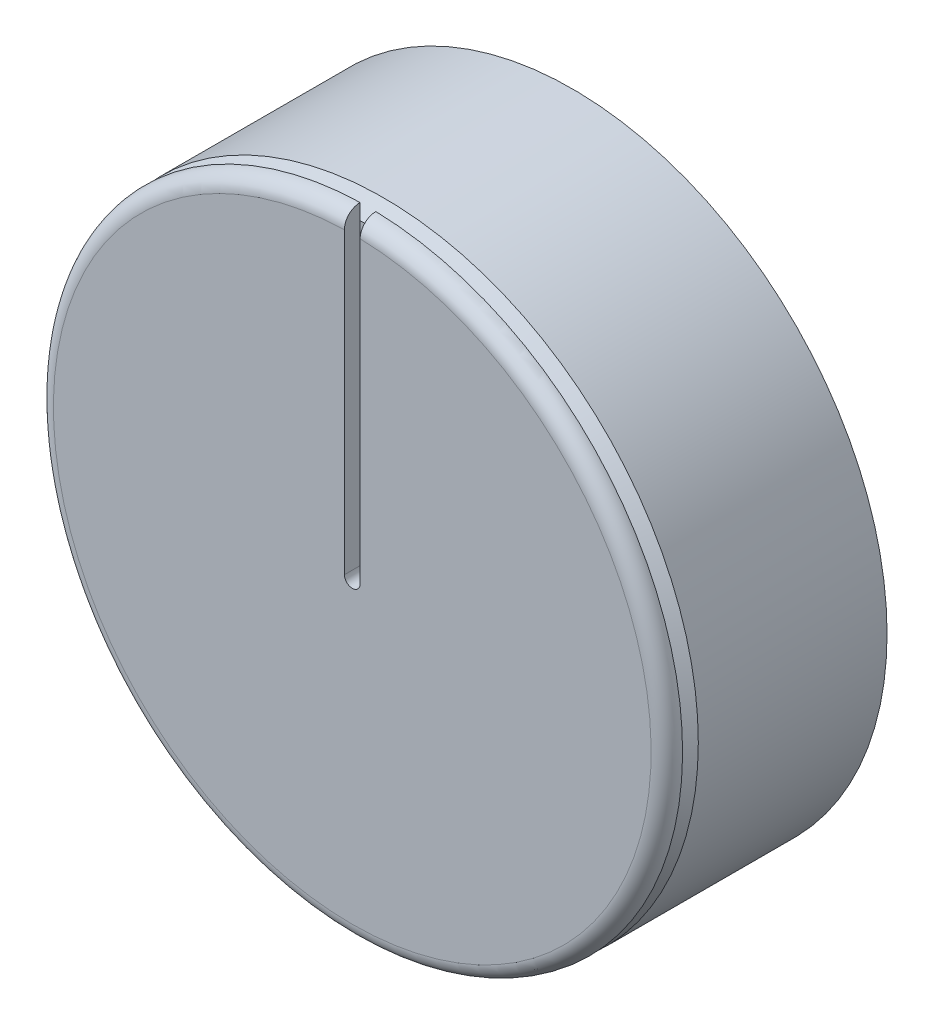
ISO-10303-21;
HEADER;
FILE_DESCRIPTION(('STEP AP214'),'2;1');
FILE_NAME('part.step','',(''),(''),'','','');
FILE_SCHEMA(('AUTOMOTIVE_DESIGN { 1 0 10303 214 1 1 1 1 }'));
ENDSEC;
DATA;
#1=APPLICATION_CONTEXT('core data for automotive mechanical design processes');
#2=APPLICATION_PROTOCOL_DEFINITION('international standard','automotive_design',2000,#1);
#3=PRODUCT_CONTEXT('',#1,'mechanical');
#4=PRODUCT('Part','Part','',(#3));
#5=PRODUCT_RELATED_PRODUCT_CATEGORY('part','',(#4));
#6=PRODUCT_DEFINITION_FORMATION('','',#4);
#7=PRODUCT_DEFINITION_CONTEXT('part definition',#1,'design');
#8=PRODUCT_DEFINITION('design','',#6,#7);
#9=PRODUCT_DEFINITION_SHAPE('','',#8);
#10=(LENGTH_UNIT() NAMED_UNIT(*) SI_UNIT(.MILLI.,.METRE.));
#11=(NAMED_UNIT(*) PLANE_ANGLE_UNIT() SI_UNIT($,.RADIAN.));
#12=(NAMED_UNIT(*) SI_UNIT($,.STERADIAN.) SOLID_ANGLE_UNIT());
#13=UNCERTAINTY_MEASURE_WITH_UNIT(LENGTH_MEASURE(1.E-05),#10,'distance_accuracy_value','');
#14=(GEOMETRIC_REPRESENTATION_CONTEXT(3) GLOBAL_UNCERTAINTY_ASSIGNED_CONTEXT((#13)) GLOBAL_UNIT_ASSIGNED_CONTEXT((#10,
#11,#12)) REPRESENTATION_CONTEXT('',''));
#15=CARTESIAN_POINT('',(0.,0.,0.));
#16=DIRECTION('',(0.,0.,1.));
#17=DIRECTION('',(1.,0.,0.));
#18=AXIS2_PLACEMENT_3D('',#15,#16,#17);
#19=CARTESIAN_POINT('',(51.1819708147866,-61.9743537667184,15.));
#20=DIRECTION('',(0.,0.,-1.));
#21=DIRECTION('',(-1.,0.,0.));
#22=AXIS2_PLACEMENT_3D('',#19,#20,#21);
#23=CYLINDRICAL_SURFACE('',#22,20.);
#24=CARTESIAN_POINT('',(51.1819708147866,-61.9743537667184,1.));
#25=DIRECTION('',(0.,0.,1.));
#26=DIRECTION('',(1.,0.,0.));
#27=AXIS2_PLACEMENT_3D('',#24,#25,#26);
#28=CIRCLE('',#27,20.);
#29=CARTESIAN_POINT('',(71.1819708147866,-61.9743537667184,1.));
#30=VERTEX_POINT('',#29);
#31=EDGE_CURVE('E132',#30,#30,#28,.T.);
#32=ORIENTED_EDGE('',*,*,#31,.T.);
#33=EDGE_LOOP('',(#32));
#34=FACE_BOUND('',#33,.T.);
#35=CARTESIAN_POINT('',(51.1819708147866,-61.9743537667184,13.));
#36=DIRECTION('',(0.,0.,1.));
#37=DIRECTION('',(1.,0.,0.));
#38=AXIS2_PLACEMENT_3D('',#35,#36,#37);
#39=CIRCLE('',#38,20.);
#40=CARTESIAN_POINT('',(71.1819708147866,-61.9743537667184,13.));
#41=VERTEX_POINT('',#40);
#42=EDGE_CURVE('E113',#41,#41,#39,.T.);
#43=ORIENTED_EDGE('',*,*,#42,.F.);
#44=EDGE_LOOP('',(#43));
#45=FACE_BOUND('',#44,.T.);
#46=ADVANCED_FACE('F43',(#34,#45),#23,.T.);
#47=CARTESIAN_POINT('',(51.1819708147866,-61.9743537667184,1.));
#48=DIRECTION('',(0.,0.,1.));
#49=DIRECTION('',(1.,0.,0.));
#50=AXIS2_PLACEMENT_3D('',#47,#48,#49);
#51=PLANE('',#50);
#52=CARTESIAN_POINT('',(51.1819708147866,-61.9743537667185,1.));
#53=DIRECTION('',(0.,0.,-1.));
#54=DIRECTION('',(-1.,0.,0.));
#55=AXIS2_PLACEMENT_3D('',#52,#53,#54);
#56=CIRCLE('',#55,10.);
#57=CARTESIAN_POINT('',(41.1819708147866,-61.9743537667185,1.));
#58=VERTEX_POINT('',#57);
#59=EDGE_CURVE('E268',#58,#58,#56,.T.);
#60=ORIENTED_EDGE('',*,*,#59,.F.);
#61=EDGE_LOOP('',(#60));
#62=FACE_BOUND('',#61,.T.);
#63=ORIENTED_EDGE('',*,*,#31,.F.);
#64=EDGE_LOOP('',(#63));
#65=FACE_BOUND('',#64,.T.);
#66=ADVANCED_FACE('F166',(#62,#65),#51,.F.);
#67=CARTESIAN_POINT('',(51.1819708147866,-61.9743537667184,14.));
#68=DIRECTION('',(0.,0.,1.));
#69=DIRECTION('',(1.,0.,0.));
#70=AXIS2_PLACEMENT_3D('',#67,#68,#69);
#71=PLANE('',#70);
#72=CARTESIAN_POINT('',(51.1819708147866,-61.9743537667184,14.));
#73=DIRECTION('',(0.,0.,1.));
#74=DIRECTION('',(1.,0.,0.));
#75=AXIS2_PLACEMENT_3D('',#72,#73,#74);
#76=CIRCLE('',#75,19.);
#77=CARTESIAN_POINT('',(50.6819708147866,-42.9809338534959,14.));
#78=VERTEX_POINT('',#77);
#79=CARTESIAN_POINT('',(51.6819708147866,-42.9809338534959,14.));
#80=VERTEX_POINT('',#79);
#81=EDGE_CURVE('E59',#78,#80,#76,.T.);
#82=ORIENTED_EDGE('',*,*,#81,.T.);
#83=DIRECTION('',(0.,1.,0.));
#84=VECTOR('',#83,1.);
#85=CARTESIAN_POINT('',(51.6819708147866,-61.9743537667184,14.));
#86=LINE('',#85,#84);
#87=CARTESIAN_POINT('',(51.6819708147866,-41.9806047435863,14.));
#88=VERTEX_POINT('',#87);
#89=EDGE_CURVE('E91',#80,#88,#86,.T.);
#90=ORIENTED_EDGE('',*,*,#89,.T.);
#91=CARTESIAN_POINT('',(51.1819708147866,-61.9743537667184,14.));
#92=DIRECTION('',(0.,0.,1.));
#93=DIRECTION('',(1.,0.,0.));
#94=AXIS2_PLACEMENT_3D('',#91,#92,#93);
#95=CIRCLE('',#94,20.);
#96=CARTESIAN_POINT('',(50.6819708147866,-41.9806047435863,14.));
#97=VERTEX_POINT('',#96);
#98=EDGE_CURVE('E139',#88,#97,#95,.F.);
#99=ORIENTED_EDGE('',*,*,#98,.T.);
#100=DIRECTION('',(0.,-1.,0.));
#101=VECTOR('',#100,1.);
#102=CARTESIAN_POINT('',(50.6819708147866,-61.9743537667184,14.));
#103=LINE('',#102,#101);
#104=EDGE_CURVE('E93',#97,#78,#103,.T.);
#105=ORIENTED_EDGE('',*,*,#104,.T.);
#106=EDGE_LOOP('',(#82,#90,#99,#105));
#107=FACE_BOUND('',#106,.T.);
#108=ADVANCED_FACE('F90',(#107),#71,.F.);
#109=CARTESIAN_POINT('',(51.1819708147866,-61.9743537667184,15.));
#110=DIRECTION('',(0.,0.,1.));
#111=DIRECTION('',(1.,0.,0.));
#112=AXIS2_PLACEMENT_3D('',#109,#110,#111);
#113=PLANE('',#112);
#114=DIRECTION('',(0.,-1.,0.));
#115=VECTOR('',#114,1.);
#116=CARTESIAN_POINT('',(50.6819708147866,-61.9743537667184,15.));
#117=LINE('',#116,#115);
#118=CARTESIAN_POINT('',(50.6819708147866,-42.9809338534959,15.));
#119=VERTEX_POINT('',#118);
#120=CARTESIAN_POINT('',(50.6819708147866,-61.9743537667184,15.));
#121=VERTEX_POINT('',#120);
#122=EDGE_CURVE('E120',#119,#121,#117,.T.);
#123=ORIENTED_EDGE('',*,*,#122,.F.);
#124=CARTESIAN_POINT('',(51.1819708147866,-61.9743537667184,15.));
#125=DIRECTION('',(0.,0.,1.));
#126=DIRECTION('',(1.,0.,0.));
#127=AXIS2_PLACEMENT_3D('',#124,#125,#126);
#128=CIRCLE('',#127,19.);
#129=CARTESIAN_POINT('',(51.6819708147866,-42.9809338534959,15.));
#130=VERTEX_POINT('',#129);
#131=EDGE_CURVE('E136',#119,#130,#128,.T.);
#132=ORIENTED_EDGE('',*,*,#131,.T.);
#133=DIRECTION('',(0.,1.,0.));
#134=VECTOR('',#133,1.);
#135=CARTESIAN_POINT('',(51.6819708147866,-61.9743537667184,15.));
#136=LINE('',#135,#134);
#137=CARTESIAN_POINT('',(51.6819708147866,-61.9743537667184,15.));
#138=VERTEX_POINT('',#137);
#139=EDGE_CURVE('E126',#138,#130,#136,.T.);
#140=ORIENTED_EDGE('',*,*,#139,.F.);
#141=CARTESIAN_POINT('',(51.1819708147866,-61.9743537667184,15.));
#142=DIRECTION('',(0.,0.,1.));
#143=DIRECTION('',(1.,0.,0.));
#144=AXIS2_PLACEMENT_3D('',#141,#142,#143);
#145=CIRCLE('',#144,0.5);
#146=EDGE_CURVE('E115',#121,#138,#145,.T.);
#147=ORIENTED_EDGE('',*,*,#146,.F.);
#148=EDGE_LOOP('',(#123,#132,#140,#147));
#149=FACE_BOUND('',#148,.T.);
#150=ADVANCED_FACE('F161',(#149),#113,.T.);
#151=CARTESIAN_POINT('',(51.1819708147866,-61.9743537667184,14.));
#152=DIRECTION('',(0.,0.,1.));
#153=DIRECTION('',(1.,0.,0.));
#154=AXIS2_PLACEMENT_3D('',#151,#152,#153);
#155=CYLINDRICAL_SURFACE('',#154,0.5);
#156=ORIENTED_EDGE('',*,*,#146,.T.);
#157=DIRECTION('',(0.,0.,1.));
#158=VECTOR('',#157,1.);
#159=CARTESIAN_POINT('',(51.6819708147866,-61.9743537667184,14.));
#160=LINE('',#159,#158);
#161=CARTESIAN_POINT('',(51.6819708147866,-61.9743537667184,14.));
#162=VERTEX_POINT('',#161);
#163=EDGE_CURVE('E123',#162,#138,#160,.T.);
#164=ORIENTED_EDGE('',*,*,#163,.F.);
#165=CARTESIAN_POINT('',(51.1819708147866,-61.9743537667184,14.));
#166=DIRECTION('',(0.,0.,1.));
#167=DIRECTION('',(1.,0.,0.));
#168=AXIS2_PLACEMENT_3D('',#165,#166,#167);
#169=CIRCLE('',#168,0.5);
#170=CARTESIAN_POINT('',(50.6819708147866,-61.9743537667184,14.));
#171=VERTEX_POINT('',#170);
#172=EDGE_CURVE('E106',#171,#162,#169,.T.);
#173=ORIENTED_EDGE('',*,*,#172,.F.);
#174=DIRECTION('',(0.,0.,1.));
#175=VECTOR('',#174,1.);
#176=CARTESIAN_POINT('',(50.6819708147866,-61.9743537667184,14.));
#177=LINE('',#176,#175);
#178=EDGE_CURVE('E129',#171,#121,#177,.T.);
#179=ORIENTED_EDGE('',*,*,#178,.T.);
#180=EDGE_LOOP('',(#156,#164,#173,#179));
#181=FACE_BOUND('',#180,.T.);
#182=ADVANCED_FACE('F158',(#181),#155,.F.);
#183=CARTESIAN_POINT('',(51.1819708147866,-61.9743537667184,14.));
#184=DIRECTION('',(0.,0.,1.));
#185=DIRECTION('',(1.,0.,0.));
#186=AXIS2_PLACEMENT_3D('',#183,#184,#185);
#187=PLANE('',#186);
#188=EDGE_CURVE('E102',#162,#80,#86,.T.);
#189=ORIENTED_EDGE('',*,*,#188,.T.);
#190=EDGE_CURVE('E95',#80,#78,#76,.T.);
#191=ORIENTED_EDGE('',*,*,#190,.T.);
#192=EDGE_CURVE('E112',#78,#171,#103,.T.);
#193=ORIENTED_EDGE('',*,*,#192,.T.);
#194=ORIENTED_EDGE('',*,*,#172,.T.);
#195=EDGE_LOOP('',(#189,#191,#193,#194));
#196=FACE_BOUND('',#195,.T.);
#197=ADVANCED_FACE('F109',(#196),#187,.T.);
#198=CARTESIAN_POINT('',(51.6819708147866,-61.9743537667184,14.));
#199=DIRECTION('',(1.,0.,0.));
#200=DIRECTION('',(0.,0.,-1.));
#201=AXIS2_PLACEMENT_3D('',#198,#199,#200);
#202=PLANE('',#201);
#203=CARTESIAN_POINT('',(51.6819708147866,-43.9596002074211,14.2071508210651));
#204=CARTESIAN_POINT('',(51.6819708147866,-43.9479592009519,14.2620944746177));
#205=CARTESIAN_POINT('',(51.6819708147866,-43.9316687414624,14.3160949328433));
#206=CARTESIAN_POINT('',(51.6819708147866,-43.8902374394171,14.4206384653411));
#207=CARTESIAN_POINT('',(51.6819708147866,-43.8650859433683,14.4711772899922));
#208=CARTESIAN_POINT('',(51.6819708147866,-43.8066641123887,14.5672939134344));
#209=CARTESIAN_POINT('',(51.6819708147866,-43.7733977669861,14.6128741341651));
#210=CARTESIAN_POINT('',(51.6819708147866,-43.6996955008416,14.6977914844961));
#211=CARTESIAN_POINT('',(51.6819708147866,-43.6592613592293,14.737130158739));
#212=CARTESIAN_POINT('',(51.6819708147866,-43.5723503747016,14.8084782024367));
#213=CARTESIAN_POINT('',(51.6819708147866,-43.5258714227287,14.8404850029592));
#214=CARTESIAN_POINT('',(51.6819708147866,-43.428199423932,14.8962455361539));
#215=CARTESIAN_POINT('',(51.6819708147866,-43.3770061830899,14.9199989289618));
#216=CARTESIAN_POINT('',(51.6819708147866,-43.2713421029807,14.9585847852159));
#217=CARTESIAN_POINT('',(51.6819708147866,-43.2168701823052,14.9734142873576));
#218=CARTESIAN_POINT('',(51.6819708147866,-43.1062101254406,14.9937198413222));
#219=CARTESIAN_POINT('',(51.6819708147866,-43.0500219902484,14.999195898578));
#220=CARTESIAN_POINT('',(51.6819708147866,-42.9375119270536,15.0006395202231));
#221=CARTESIAN_POINT('',(51.6819708147866,-42.8811899736021,14.9966051022294));
#222=CARTESIAN_POINT('',(51.6819708147866,-42.7700228887629,14.9791377602072));
#223=CARTESIAN_POINT('',(51.6819708147866,-42.715177755046,14.9657048510019));
#224=CARTESIAN_POINT('',(51.6819708147866,-42.6085223737429,14.9298213345222));
#225=CARTESIAN_POINT('',(51.6819708147866,-42.5567120749555,14.9073708794342));
#226=CARTESIAN_POINT('',(51.6819708147866,-42.4575970399899,14.8540885676753));
#227=CARTESIAN_POINT('',(51.6819708147866,-42.4102923043998,14.8232567099101));
#228=CARTESIAN_POINT('',(51.6819708147866,-42.3215425393769,14.7540936268535));
#229=CARTESIAN_POINT('',(51.6819708147866,-42.2800962423371,14.7157640281615));
#230=CARTESIAN_POINT('',(51.6819708147866,-42.2042294031471,14.6326886974174));
#231=CARTESIAN_POINT('',(51.6819708147866,-42.1698088467187,14.5879429784047));
#232=CARTESIAN_POINT('',(51.6819708147866,-42.1089820070054,14.4933205726669));
#233=CARTESIAN_POINT('',(51.6819708147866,-42.0825732216997,14.4434454943337));
#234=CARTESIAN_POINT('',(51.6819708147866,-42.038506489903,14.3399686849328));
#235=CARTESIAN_POINT('',(51.6819708147866,-42.0208485301763,14.2863669595017));
#236=CARTESIAN_POINT('',(51.6819708147866,-41.9947894854587,14.1769745608123));
#237=CARTESIAN_POINT('',(51.6819708147866,-41.9863858150185,14.1211845034399));
#238=CARTESIAN_POINT('',(51.6819708147866,-41.9790655473474,14.0089854423255));
#239=CARTESIAN_POINT('',(51.6819708147866,-41.9801489399258,13.9525764392483));
#240=CARTESIAN_POINT('',(51.6819708147866,-41.9917711472445,13.8407490318731));
#241=CARTESIAN_POINT('',(51.6819708147866,-42.0023086495214,13.7853304911636));
#242=CARTESIAN_POINT('',(51.6819708147866,-42.0325376044237,13.6770489560347));
#243=CARTESIAN_POINT('',(51.6819708147866,-42.0522290571459,13.6241859616422));
#244=CARTESIAN_POINT('',(51.6819708147866,-42.1002074191794,13.522512836838));
#245=CARTESIAN_POINT('',(51.6819708147866,-42.1284947831441,13.4737029209749));
#246=CARTESIAN_POINT('',(51.6819708147866,-42.1928607537036,13.3815235291038));
#247=CARTESIAN_POINT('',(51.6819708147866,-42.2289393669323,13.3381540577283));
#248=CARTESIAN_POINT('',(51.6819708147866,-42.3078720698183,13.258075957457));
#249=CARTESIAN_POINT('',(51.6819708147866,-42.3507276824812,13.2213688297921));
#250=CARTESIAN_POINT('',(51.6819708147866,-42.4419916135297,13.1556677203741));
#251=CARTESIAN_POINT('',(51.6819708147866,-42.4903999433291,13.126673754476));
#252=CARTESIAN_POINT('',(51.6819708147866,-42.5914113630691,13.0772123982266));
#253=CARTESIAN_POINT('',(51.6819708147866,-42.6440157631665,13.0567476835132));
#254=CARTESIAN_POINT('',(51.6819708147866,-42.7519130324508,13.0249375091378));
#255=CARTESIAN_POINT('',(51.6819708147866,-42.8072059033205,13.0135920551839));
#256=CARTESIAN_POINT('',(51.6819708147866,-42.9189269221776,13.0003396396648));
#257=CARTESIAN_POINT('',(51.6819708147866,-42.975355379407,12.9984352849922));
#258=CARTESIAN_POINT('',(51.6819708147866,-43.0877313905997,13.0041259010995));
#259=CARTESIAN_POINT('',(51.6819708147866,-43.1436789432154,13.0117208984895));
#260=CARTESIAN_POINT('',(51.6819708147866,-43.2535115790555,13.0361964178962));
#261=CARTESIAN_POINT('',(51.6819708147866,-43.3073964221703,13.0530780174251));
#262=CARTESIAN_POINT('',(51.6819708147866,-43.4115668011029,13.0956490707011));
#263=CARTESIAN_POINT('',(51.6819708147866,-43.4618523305193,13.1213385401123));
#264=CARTESIAN_POINT('',(51.6819708147866,-43.5573912051662,13.1807943335919));
#265=CARTESIAN_POINT('',(51.6819708147866,-43.6026449942022,13.2145599445057));
#266=CARTESIAN_POINT('',(51.6819708147866,-43.6868375502565,13.289210251623));
#267=CARTESIAN_POINT('',(51.6819708147866,-43.7257765742463,13.3300946579957));
#268=CARTESIAN_POINT('',(51.6819708147866,-43.7962200044885,13.417804850382));
#269=CARTESIAN_POINT('',(51.6819708147866,-43.8277274174632,13.4646282217449));
#270=CARTESIAN_POINT('',(51.6819708147866,-43.8824384032765,13.5629148529086));
#271=CARTESIAN_POINT('',(51.6819708147866,-43.9056399259813,13.6143792543309));
#272=CARTESIAN_POINT('',(51.6819708147866,-43.9430704027933,13.720474757641));
#273=CARTESIAN_POINT('',(51.6819708147866,-43.9572983317053,13.775106220574));
#274=CARTESIAN_POINT('',(51.6819708147866,-43.9763575599952,13.8859378022811));
#275=CARTESIAN_POINT('',(51.6819708147866,-43.9812001673033,13.9421359504724));
#276=CARTESIAN_POINT('',(51.6819708147866,-43.9813592639658,14.0333720475409));
#277=CARTESIAN_POINT('',(51.6819708147866,-43.9795704845744,14.0684299725949));
#278=CARTESIAN_POINT('',(51.6819708147866,-43.972325522329,14.1381647980786));
#279=CARTESIAN_POINT('',(51.6819708147866,-43.9668693402664,14.1728416985905));
#280=CARTESIAN_POINT('',(51.6819708147866,-43.9596002074211,14.2071508210651));
#281=B_SPLINE_CURVE_WITH_KNOTS('',3,(#203,#204,#205,#206,#207,#208,#209,#210,#211,#212,#213,
#214,#215,#216,#217,#218,#219,#220,#221,#222,#223,#224,#225,#226,#227,#228,#229,#230,#231,#232,
#233,#234,#235,#236,#237,#238,#239,#240,#241,#242,#243,#244,#245,#246,#247,#248,#249,#250,#251,
#252,#253,#254,#255,#256,#257,#258,#259,#260,#261,#262,#263,#264,#265,#266,#267,#268,#269,#270,
#271,#272,#273,#274,#275,#276,#277,#278,#279,#280),.UNSPECIFIED.,.T.,.F.,(4,2,2,2,2,2,2,2,2,2,2,
2,2,2,2,2,2,2,2,2,2,2,2,2,2,2,2,2,2,2,2,2,2,2,2,2,2,2,4),(0.,0.168361893209188,
0.336926900118147,0.505409201331711,0.673849741702905,0.842349210079655,1.01085561621287,
1.17941790873206,1.34798010334285,1.51657743651181,1.68517450377144,1.8537687257893,
2.02236296981902,2.19092067860526,2.35947804483602,2.52798271745217,2.6964871352028,
2.86494446449468,3.03340161283804,3.20183537879546,3.37026914653061,3.53871182458659,
3.70715464606775,3.87563537590452,4.04411645206219,4.21265034125712,4.38118433594695,
4.54976486394443,4.71834586418155,4.88694642877817,5.05554729322173,5.22413327505237,
5.39271239476905,5.56122319237355,5.7297755546816,5.89834716989588,6.0667155545653,
6.17184780710082,6.27698003695236),.UNSPECIFIED.);
#282=EDGE_CURVE('E53',#130,#88,#281,.T.);
#283=ORIENTED_EDGE('',*,*,#282,.T.);
#284=ORIENTED_EDGE('',*,*,#89,.F.);
#285=ORIENTED_EDGE('',*,*,#188,.F.);
#286=ORIENTED_EDGE('',*,*,#163,.T.);
#287=ORIENTED_EDGE('',*,*,#139,.T.);
#288=EDGE_LOOP('',(#283,#284,#285,#286,#287));
#289=FACE_BOUND('',#288,.T.);
#290=ADVANCED_FACE('F101',(#289),#202,.F.);
#291=CARTESIAN_POINT('',(50.6819708147866,-61.9743537667184,14.));
#292=DIRECTION('',(-1.,0.,0.));
#293=DIRECTION('',(0.,0.,1.));
#294=AXIS2_PLACEMENT_3D('',#291,#292,#293);
#295=PLANE('',#294);
#296=CARTESIAN_POINT('',(50.6819708147866,-43.9596002074211,14.2071508210651));
#297=CARTESIAN_POINT('',(50.6819708147866,-43.9712336873581,14.1522186321598));
#298=CARTESIAN_POINT('',(50.6819708147866,-43.9782367125036,14.0962640115377));
#299=CARTESIAN_POINT('',(50.6819708147866,-43.9827534874872,13.9839267181733));
#300=CARTESIAN_POINT('',(50.6819708147866,-43.9802558165796,13.9275436116164));
#301=CARTESIAN_POINT('',(50.6819708147866,-43.9658288028289,13.8160193819241));
#302=CARTESIAN_POINT('',(50.6819708147866,-43.9539039801947,13.7608776765803));
#303=CARTESIAN_POINT('',(50.6819708147866,-43.9209694810201,13.6533940377149));
#304=CARTESIAN_POINT('',(50.6819708147866,-43.8999620551287,13.6010514141954));
#305=CARTESIAN_POINT('',(50.6819708147866,-43.8494561089083,13.5006249292788));
#306=CARTESIAN_POINT('',(50.6819708147866,-43.8199560739173,13.4525418295727));
#307=CARTESIAN_POINT('',(50.6819708147866,-43.7533033619233,13.3620069974293));
#308=CARTESIAN_POINT('',(50.6819708147866,-43.716150374912,13.3195554932332));
#309=CARTESIAN_POINT('',(50.6819708147866,-43.6352361864656,13.241477802352));
#310=CARTESIAN_POINT('',(50.6819708147866,-43.591473111363,13.2058535574097));
#311=CARTESIAN_POINT('',(50.6819708147866,-43.498589218049,13.1424547912203));
#312=CARTESIAN_POINT('',(50.6819708147866,-43.4494683996645,13.1146802702271));
#313=CARTESIAN_POINT('',(50.6819708147866,-43.347244092801,13.0677588130162));
#314=CARTESIAN_POINT('',(50.6819708147866,-43.2941391598897,13.0486150236556));
#315=CARTESIAN_POINT('',(50.6819708147866,-43.1854696122819,13.019512209598));
#316=CARTESIAN_POINT('',(50.6819708147866,-43.1299049980605,13.0095531831266));
#317=CARTESIAN_POINT('',(50.6819708147866,-43.01787829288,12.9991006766472));
#318=CARTESIAN_POINT('',(50.6819708147866,-42.96141597909,12.9986095847175));
#319=CARTESIAN_POINT('',(50.6819708147866,-42.8492101388079,13.0071131628208));
#320=CARTESIAN_POINT('',(50.6819708147866,-42.7934666134575,13.016107847918));
#321=CARTESIAN_POINT('',(50.6819708147866,-42.6842788325589,13.0433288564312));
#322=CARTESIAN_POINT('',(50.6819708147866,-42.6308346625737,13.0615555230633));
#323=CARTESIAN_POINT('',(50.6819708147866,-42.5277656925171,13.1067242047794));
#324=CARTESIAN_POINT('',(50.6819708147866,-42.4781408883054,13.1336662104153));
#325=CARTESIAN_POINT('',(50.6819708147866,-42.3841289851386,13.1954961549053));
#326=CARTESIAN_POINT('',(50.6819708147866,-42.3397409655978,13.2303826940035));
#327=CARTESIAN_POINT('',(50.6819708147866,-42.2574541153298,13.3071147826431));
#328=CARTESIAN_POINT('',(50.6819708147866,-42.2195552755924,13.3489603225216));
#329=CARTESIAN_POINT('',(50.6819708147866,-42.1513348843631,13.4384090899796));
#330=CARTESIAN_POINT('',(50.6819708147866,-42.1210110515941,13.4860105776824));
#331=CARTESIAN_POINT('',(50.6819708147866,-42.0687881844539,13.585630039314));
#332=CARTESIAN_POINT('',(50.6819708147866,-42.0468891353613,13.6376480055253));
#333=CARTESIAN_POINT('',(50.6819708147866,-42.0121440672728,13.7446070795912));
#334=CARTESIAN_POINT('',(50.6819708147866,-41.999295347086,13.7995473099875));
#335=CARTESIAN_POINT('',(50.6819708147866,-41.9830057991912,13.9108051906026));
#336=CARTESIAN_POINT('',(50.6819708147866,-41.9795649604159,13.9671228392009));
#337=CARTESIAN_POINT('',(50.6819708147866,-41.9821888020923,14.0795261150388));
#338=CARTESIAN_POINT('',(50.6819708147866,-41.9882517783358,14.1356117820687));
#339=CARTESIAN_POINT('',(50.6819708147866,-42.0097076330375,14.24596913716));
#340=CARTESIAN_POINT('',(50.6819708147866,-42.0251005075953,14.3002408259796));
#341=CARTESIAN_POINT('',(50.6819708147866,-42.0647786209742,14.4054302649299));
#342=CARTESIAN_POINT('',(50.6819708147866,-42.0890639150704,14.45634799421));
#343=CARTESIAN_POINT('',(50.6819708147866,-42.1458366244106,14.5533846595438));
#344=CARTESIAN_POINT('',(50.6819708147866,-42.1783240492014,14.5995035900118));
#345=CARTESIAN_POINT('',(50.6819708147866,-42.2505850204689,14.6856431445908));
#346=CARTESIAN_POINT('',(50.6819708147866,-42.2903599502808,14.7256626082369));
#347=CARTESIAN_POINT('',(50.6819708147866,-42.3760621276724,14.7984582845183));
#348=CARTESIAN_POINT('',(50.6819708147866,-42.4219893782288,14.8312344936491));
#349=CARTESIAN_POINT('',(50.6819708147866,-42.5187072954958,14.8886239257555));
#350=CARTESIAN_POINT('',(50.6819708147866,-42.5694994278641,14.9132346786676));
#351=CARTESIAN_POINT('',(50.6819708147866,-42.6744938119912,14.9535825381025));
#352=CARTESIAN_POINT('',(50.6819708147866,-42.7286960758517,14.969319613133));
#353=CARTESIAN_POINT('',(50.6819708147866,-42.8389891703045,14.991477848929));
#354=CARTESIAN_POINT('',(50.6819708147866,-42.8950805538405,14.9978962574506));
#355=CARTESIAN_POINT('',(50.6819708147866,-43.0075449776332,15.0012267481079));
#356=CARTESIAN_POINT('',(50.6819708147866,-43.0639180187942,14.9981387996999));
#357=CARTESIAN_POINT('',(50.6819708147866,-43.1753561795922,14.9825427302044));
#358=CARTESIAN_POINT('',(50.6819708147866,-43.2304210576959,14.9700328832317));
#359=CARTESIAN_POINT('',(50.6819708147866,-43.337666743464,14.9359460844519));
#360=CARTESIAN_POINT('',(50.6819708147866,-43.3898476639268,14.9143694875512));
#361=CARTESIAN_POINT('',(50.6819708147866,-43.4898378137286,14.862765382369));
#362=CARTESIAN_POINT('',(50.6819708147866,-43.5376477274832,14.8327392001431));
#363=CARTESIAN_POINT('',(50.6819708147866,-43.6275587100712,14.7650753910519));
#364=CARTESIAN_POINT('',(50.6819708147866,-43.6696583635815,14.7274358829151));
#365=CARTESIAN_POINT('',(50.6819708147866,-43.7469434199007,14.6456164220289));
#366=CARTESIAN_POINT('',(50.6819708147866,-43.782127337742,14.6014350681576));
#367=CARTESIAN_POINT('',(50.6819708147866,-43.8445384594512,14.5078235120021));
#368=CARTESIAN_POINT('',(50.6819708147866,-43.8717752038352,14.4583997012931));
#369=CARTESIAN_POINT('',(50.6819708147866,-43.9089577215257,14.3750125973164));
#370=CARTESIAN_POINT('',(50.6819708147866,-43.9215569611536,14.342205141282));
#371=CARTESIAN_POINT('',(50.6819708147866,-43.9432410281086,14.2754486516874));
#372=CARTESIAN_POINT('',(50.6819708147866,-43.9523258560479,14.241499618326));
#373=CARTESIAN_POINT('',(50.6819708147866,-43.9596002074211,14.2071508210651));
#374=B_SPLINE_CURVE_WITH_KNOTS('',3,(#296,#297,#298,#299,#300,#301,#302,#303,#304,#305,#306,
#307,#308,#309,#310,#311,#312,#313,#314,#315,#316,#317,#318,#319,#320,#321,#322,#323,#324,#325,
#326,#327,#328,#329,#330,#331,#332,#333,#334,#335,#336,#337,#338,#339,#340,#341,#342,#343,#344,
#345,#346,#347,#348,#349,#350,#351,#352,#353,#354,#355,#356,#357,#358,#359,#360,#361,#362,#363,
#364,#365,#366,#367,#368,#369,#370,#371,#372,#373),.UNSPECIFIED.,.T.,.F.,(4,2,2,2,2,2,2,2,2,2,2,
2,2,2,2,2,2,2,2,2,2,2,2,2,2,2,2,2,2,2,2,2,2,2,2,2,2,2,4),(0.,0.16832346846231,0.336849341743262,
0.50529445781428,0.673697857463029,0.842131310590953,1.01057158801984,1.17905970072966,
1.34754781888627,1.51609732002427,1.68464678859811,1.85323876951525,2.0218310181738,
2.19042953502458,2.35902786910206,2.52759652061119,2.69616493806012,2.86468252834459,
3.03319982416196,3.20166680241655,3.37013358249032,3.53857015683954,3.70700666077445,
3.87544421172454,4.04388195872596,4.21235171225441,4.38082154729499,4.54934229836443,
4.71786364750637,4.88643475887336,5.05500641185566,5.22360895098029,5.39220489098645,
5.56077438673237,5.72938558741008,5.89803295333809,6.06647701855907,6.17172878104847,
6.27698052520206),.UNSPECIFIED.);
#375=EDGE_CURVE('E12',#97,#119,#374,.T.);
#376=ORIENTED_EDGE('',*,*,#375,.T.);
#377=ORIENTED_EDGE('',*,*,#122,.T.);
#378=ORIENTED_EDGE('',*,*,#178,.F.);
#379=ORIENTED_EDGE('',*,*,#192,.F.);
#380=ORIENTED_EDGE('',*,*,#104,.F.);
#381=EDGE_LOOP('',(#376,#377,#378,#379,#380));
#382=FACE_BOUND('',#381,.T.);
#383=ADVANCED_FACE('F155',(#382),#295,.F.);
#384=CARTESIAN_POINT('',(51.1819708147866,-61.9743537667184,14.));
#385=DIRECTION('',(0.,0.,1.));
#386=DIRECTION('',(1.,0.,0.));
#387=AXIS2_PLACEMENT_3D('',#384,#385,#386);
#388=TOROIDAL_SURFACE('',#387,19.,1.);
#389=ORIENTED_EDGE('',*,*,#375,.F.);
#390=ORIENTED_EDGE('',*,*,#98,.F.);
#391=ORIENTED_EDGE('',*,*,#282,.F.);
#392=ORIENTED_EDGE('',*,*,#131,.F.);
#393=EDGE_LOOP('',(#389,#390,#391,#392));
#394=FACE_BOUND('',#393,.T.);
#395=ADVANCED_FACE('F149',(#394),#388,.T.);
#396=CARTESIAN_POINT('',(51.1819708147866,-61.9743537667184,14.));
#397=DIRECTION('',(0.,0.,-1.));
#398=DIRECTION('',(-1.,0.,0.));
#399=AXIS2_PLACEMENT_3D('',#396,#397,#398);
#400=CONICAL_SURFACE('',#399,19.,0.785398163397441);
#401=ORIENTED_EDGE('',*,*,#42,.T.);
#402=EDGE_LOOP('',(#401));
#403=FACE_BOUND('',#402,.T.);
#404=ORIENTED_EDGE('',*,*,#81,.F.);
#405=ORIENTED_EDGE('',*,*,#190,.F.);
#406=EDGE_LOOP('',(#404,#405));
#407=FACE_BOUND('',#406,.T.);
#408=ADVANCED_FACE('F46',(#403,#407),#400,.T.);
#409=CARTESIAN_POINT('',(51.1819708147866,-61.9743537667185,6.));
#410=DIRECTION('',(0.,0.,-1.));
#411=DIRECTION('',(-1.,0.,0.));
#412=AXIS2_PLACEMENT_3D('',#409,#410,#411);
#413=PLANE('',#412);
#414=CARTESIAN_POINT('',(51.1819708147866,-61.9743537667185,6.));
#415=DIRECTION('',(0.,0.,-1.));
#416=DIRECTION('',(-1.,0.,0.));
#417=AXIS2_PLACEMENT_3D('',#414,#415,#416);
#418=CIRCLE('',#417,10.);
#419=CARTESIAN_POINT('',(41.1819708147866,-61.9743537667185,6.));
#420=VERTEX_POINT('',#419);
#421=EDGE_CURVE('E264',#420,#420,#418,.T.);
#422=ORIENTED_EDGE('',*,*,#421,.T.);
#423=EDGE_LOOP('',(#422));
#424=FACE_BOUND('',#423,.T.);
#425=CARTESIAN_POINT('',(51.1819708147866,-61.9743537667185,6.));
#426=DIRECTION('',(0.,0.,-1.));
#427=DIRECTION('',(-1.,0.,0.));
#428=AXIS2_PLACEMENT_3D('',#425,#426,#427);
#429=CIRCLE('',#428,3.025);
#430=CARTESIAN_POINT('',(48.1569708147866,-61.9743537667185,6.));
#431=VERTEX_POINT('',#430);
#432=EDGE_CURVE('E48',#431,#431,#429,.F.);
#433=ORIENTED_EDGE('',*,*,#432,.T.);
#434=EDGE_LOOP('',(#433));
#435=FACE_BOUND('',#434,.T.);
#436=ADVANCED_FACE('F178',(#424,#435),#413,.T.);
#437=CARTESIAN_POINT('',(51.1819708147866,-61.9743537667185,6.));
#438=DIRECTION('',(0.,0.,-1.));
#439=DIRECTION('',(-1.,0.,0.));
#440=AXIS2_PLACEMENT_3D('',#437,#438,#439);
#441=CYLINDRICAL_SURFACE('',#440,10.);
#442=ORIENTED_EDGE('',*,*,#421,.F.);
#443=EDGE_LOOP('',(#442));
#444=FACE_BOUND('',#443,.T.);
#445=ORIENTED_EDGE('',*,*,#59,.T.);
#446=EDGE_LOOP('',(#445));
#447=FACE_BOUND('',#446,.T.);
#448=ADVANCED_FACE('F183',(#444,#447),#441,.F.);
#449=CARTESIAN_POINT('',(51.1819708147866,-61.9743537667185,11.5));
#450=DIRECTION('',(0.,0.,-1.));
#451=DIRECTION('',(-1.,0.,0.));
#452=AXIS2_PLACEMENT_3D('',#449,#450,#451);
#453=PLANE('',#452);
#454=CARTESIAN_POINT('',(51.1819708147866,-61.9743537667185,11.5));
#455=DIRECTION('',(0.,0.,-1.));
#456=DIRECTION('',(-1.,0.,0.));
#457=AXIS2_PLACEMENT_3D('',#454,#455,#456);
#458=CIRCLE('',#457,3.025);
#459=CARTESIAN_POINT('',(48.1569708147866,-61.9743537667185,11.5));
#460=VERTEX_POINT('',#459);
#461=EDGE_CURVE('E96',#460,#460,#458,.T.);
#462=ORIENTED_EDGE('',*,*,#461,.T.);
#463=EDGE_LOOP('',(#462));
#464=FACE_BOUND('',#463,.T.);
#465=ADVANCED_FACE('F230',(#464),#453,.T.);
#466=CARTESIAN_POINT('',(51.1819708147866,-61.9743537667185,11.5));
#467=DIRECTION('',(0.,0.,-1.));
#468=DIRECTION('',(-1.,0.,0.));
#469=AXIS2_PLACEMENT_3D('',#466,#467,#468);
#470=CYLINDRICAL_SURFACE('',#469,3.025);
#471=CARTESIAN_POINT('',(48.1569708147866,-61.9743537667185,11.5));
#472=CARTESIAN_POINT('',(48.1569708147866,-61.9743537667185,11.4427083333333));
#473=CARTESIAN_POINT('',(48.1569708147866,-61.9743537667185,11.3854166666667));
#474=CARTESIAN_POINT('',(48.1569708147866,-61.9743537667185,11.2708333333333));
#475=CARTESIAN_POINT('',(48.1569708147866,-61.9743537667185,11.2135416666667));
#476=CARTESIAN_POINT('',(48.1569708147866,-61.9743537667185,11.0989583333333));
#477=CARTESIAN_POINT('',(48.1569708147866,-61.9743537667185,11.0416666666667));
#478=CARTESIAN_POINT('',(48.1569708147866,-61.9743537667185,10.9270833333333));
#479=CARTESIAN_POINT('',(48.1569708147866,-61.9743537667185,10.8697916666667));
#480=CARTESIAN_POINT('',(48.1569708147866,-61.9743537667185,10.7552083333333));
#481=CARTESIAN_POINT('',(48.1569708147866,-61.9743537667185,10.6979166666667));
#482=CARTESIAN_POINT('',(48.1569708147866,-61.9743537667185,10.5833333333333));
#483=CARTESIAN_POINT('',(48.1569708147866,-61.9743537667185,10.5260416666667));
#484=CARTESIAN_POINT('',(48.1569708147866,-61.9743537667185,10.4114583333333));
#485=CARTESIAN_POINT('',(48.1569708147866,-61.9743537667185,10.3541666666667));
#486=CARTESIAN_POINT('',(48.1569708147866,-61.9743537667185,10.2395833333333));
#487=CARTESIAN_POINT('',(48.1569708147866,-61.9743537667185,10.1822916666667));
#488=CARTESIAN_POINT('',(48.1569708147866,-61.9743537667185,10.0677083333333));
#489=CARTESIAN_POINT('',(48.1569708147866,-61.9743537667185,10.0104166666667));
#490=CARTESIAN_POINT('',(48.1569708147866,-61.9743537667185,9.89583333333333));
#491=CARTESIAN_POINT('',(48.1569708147866,-61.9743537667185,9.83854166666667));
#492=CARTESIAN_POINT('',(48.1569708147866,-61.9743537667185,9.72395833333333));
#493=CARTESIAN_POINT('',(48.1569708147866,-61.9743537667185,9.66666666666667));
#494=CARTESIAN_POINT('',(48.1569708147866,-61.9743537667185,9.55208333333333));
#495=CARTESIAN_POINT('',(48.1569708147866,-61.9743537667185,9.49479166666667));
#496=CARTESIAN_POINT('',(48.1569708147866,-61.9743537667185,9.38020833333333));
#497=CARTESIAN_POINT('',(48.1569708147866,-61.9743537667185,9.32291666666667));
#498=CARTESIAN_POINT('',(48.1569708147866,-61.9743537667185,9.20833333333333));
#499=CARTESIAN_POINT('',(48.1569708147866,-61.9743537667185,9.15104166666667));
#500=CARTESIAN_POINT('',(48.1569708147866,-61.9743537667185,9.03645833333333));
#501=CARTESIAN_POINT('',(48.1569708147866,-61.9743537667185,8.97916666666667));
#502=CARTESIAN_POINT('',(48.1569708147866,-61.9743537667185,8.86458333333333));
#503=CARTESIAN_POINT('',(48.1569708147866,-61.9743537667185,8.80729166666667));
#504=CARTESIAN_POINT('',(48.1569708147866,-61.9743537667185,8.69270833333333));
#505=CARTESIAN_POINT('',(48.1569708147866,-61.9743537667185,8.63541666666667));
#506=CARTESIAN_POINT('',(48.1569708147866,-61.9743537667185,8.52083333333333));
#507=CARTESIAN_POINT('',(48.1569708147866,-61.9743537667185,8.46354166666667));
#508=CARTESIAN_POINT('',(48.1569708147866,-61.9743537667185,8.34895833333333));
#509=CARTESIAN_POINT('',(48.1569708147866,-61.9743537667185,8.29166666666667));
#510=CARTESIAN_POINT('',(48.1569708147866,-61.9743537667185,8.17708333333333));
#511=CARTESIAN_POINT('',(48.1569708147866,-61.9743537667185,8.11979166666667));
#512=CARTESIAN_POINT('',(48.1569708147866,-61.9743537667185,8.00520833333333));
#513=CARTESIAN_POINT('',(48.1569708147866,-61.9743537667185,7.94791666666667));
#514=CARTESIAN_POINT('',(48.1569708147866,-61.9743537667185,7.83333333333333));
#515=CARTESIAN_POINT('',(48.1569708147866,-61.9743537667185,7.77604166666667));
#516=CARTESIAN_POINT('',(48.1569708147866,-61.9743537667185,7.66145833333333));
#517=CARTESIAN_POINT('',(48.1569708147866,-61.9743537667185,7.60416666666667));
#518=CARTESIAN_POINT('',(48.1569708147866,-61.9743537667185,7.48958333333333));
#519=CARTESIAN_POINT('',(48.1569708147866,-61.9743537667185,7.43229166666667));
#520=CARTESIAN_POINT('',(48.1569708147866,-61.9743537667185,7.31770833333333));
#521=CARTESIAN_POINT('',(48.1569708147866,-61.9743537667185,7.26041666666667));
#522=CARTESIAN_POINT('',(48.1569708147866,-61.9743537667185,7.14583333333333));
#523=CARTESIAN_POINT('',(48.1569708147866,-61.9743537667185,7.08854166666667));
#524=CARTESIAN_POINT('',(48.1569708147866,-61.9743537667185,6.97395833333333));
#525=CARTESIAN_POINT('',(48.1569708147866,-61.9743537667185,6.91666666666667));
#526=CARTESIAN_POINT('',(48.1569708147866,-61.9743537667185,6.80208333333333));
#527=CARTESIAN_POINT('',(48.1569708147866,-61.9743537667185,6.74479166666667));
#528=CARTESIAN_POINT('',(48.1569708147866,-61.9743537667185,6.63020833333333));
#529=CARTESIAN_POINT('',(48.1569708147866,-61.9743537667185,6.57291666666667));
#530=CARTESIAN_POINT('',(48.1569708147866,-61.9743537667185,6.45833333333333));
#531=CARTESIAN_POINT('',(48.1569708147866,-61.9743537667185,6.40104166666667));
#532=CARTESIAN_POINT('',(48.1569708147866,-61.9743537667185,6.28645833333333));
#533=CARTESIAN_POINT('',(48.1569708147866,-61.9743537667185,6.22916666666667));
#534=CARTESIAN_POINT('',(48.1569708147866,-61.9743537667185,6.11458333333333));
#535=CARTESIAN_POINT('',(48.1569708147866,-61.9743537667185,6.05729166666667));
#536=CARTESIAN_POINT('',(48.1569708147866,-61.9743537667185,6.));
#537=B_SPLINE_CURVE_WITH_KNOTS('',3,(#471,#472,#473,#474,#475,#476,#477,#478,#479,#480,#481,
#482,#483,#484,#485,#486,#487,#488,#489,#490,#491,#492,#493,#494,#495,#496,#497,#498,#499,#500,
#501,#502,#503,#504,#505,#506,#507,#508,#509,#510,#511,#512,#513,#514,#515,#516,#517,#518,#519,
#520,#521,#522,#523,#524,#525,#526,#527,#528,#529,#530,#531,#532,#533,#534,#535,#536),
.UNSPECIFIED.,.F.,.F.,(4,2,2,2,2,2,2,2,2,2,2,2,2,2,2,2,2,2,2,2,2,2,2,2,2,2,2,2,2,2,2,2,4),(0.,
0.171874999999998,0.343749999999999,0.515624999999999,0.687499999999999,0.859374999999999,
1.03125,1.203125,1.375,1.546875,1.71875,1.890625,2.0625,2.234375,2.40625,2.578125,2.75,2.921875,
3.09375,3.265625,3.4375,3.609375,3.78125,3.953125,4.125,4.296875,4.46875,4.640625,4.8125,
4.984375,5.15625,5.328125,5.5),.UNSPECIFIED.);
#538=EDGE_CURVE('BSEAM250',#460,#431,#537,.T.);
#539=ORIENTED_EDGE('',*,*,#461,.F.);
#540=ORIENTED_EDGE('',*,*,#432,.F.);
#541=ORIENTED_EDGE('',*,*,#538,.T.);
#542=ORIENTED_EDGE('',*,*,#538,.F.);
#543=EDGE_LOOP('',(#539,#541,#540,#542));
#544=FACE_BOUND('',#543,.T.);
#545=ADVANCED_FACE('F250',(#544),#470,.F.);
#546=CLOSED_SHELL('',(#46,#66,#108,#150,#182,#197,#290,#383,#395,#408,#436,#448,#465,#545));
#547=MANIFOLD_SOLID_BREP('B2',#546);
#548=ADVANCED_BREP_SHAPE_REPRESENTATION('',(#18,#547),#14);
#549=SHAPE_DEFINITION_REPRESENTATION(#9,#548);
ENDSEC;
END-ISO-10303-21;
